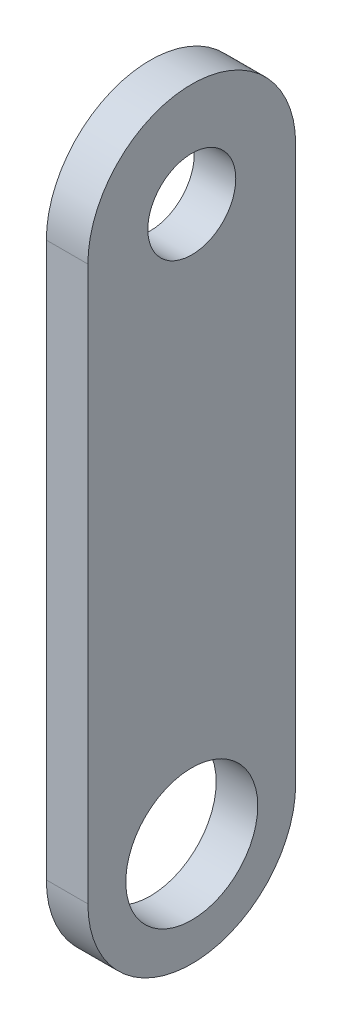
ISO-10303-21;
HEADER;
FILE_DESCRIPTION(('STEP AP214'),'2;1');
FILE_NAME('part.step','',(''),(''),'','','');
FILE_SCHEMA(('AUTOMOTIVE_DESIGN { 1 0 10303 214 1 1 1 1 }'));
ENDSEC;
DATA;
#1=APPLICATION_CONTEXT('core data for automotive mechanical design processes');
#2=APPLICATION_PROTOCOL_DEFINITION('international standard','automotive_design',2000,#1);
#3=PRODUCT_CONTEXT('',#1,'mechanical');
#4=PRODUCT('Part','Part','',(#3));
#5=PRODUCT_RELATED_PRODUCT_CATEGORY('part','',(#4));
#6=PRODUCT_DEFINITION_FORMATION('','',#4);
#7=PRODUCT_DEFINITION_CONTEXT('part definition',#1,'design');
#8=PRODUCT_DEFINITION('design','',#6,#7);
#9=PRODUCT_DEFINITION_SHAPE('','',#8);
#10=(LENGTH_UNIT() NAMED_UNIT(*) SI_UNIT(.MILLI.,.METRE.));
#11=(NAMED_UNIT(*) PLANE_ANGLE_UNIT() SI_UNIT($,.RADIAN.));
#12=(NAMED_UNIT(*) SI_UNIT($,.STERADIAN.) SOLID_ANGLE_UNIT());
#13=UNCERTAINTY_MEASURE_WITH_UNIT(LENGTH_MEASURE(1.E-05),#10,'distance_accuracy_value','');
#14=(GEOMETRIC_REPRESENTATION_CONTEXT(3) GLOBAL_UNCERTAINTY_ASSIGNED_CONTEXT((#13)) GLOBAL_UNIT_ASSIGNED_CONTEXT((#10,
#11,#12)) REPRESENTATION_CONTEXT('',''));
#15=CARTESIAN_POINT('',(0.,0.,0.));
#16=DIRECTION('',(0.,0.,1.));
#17=DIRECTION('',(1.,0.,0.));
#18=AXIS2_PLACEMENT_3D('',#15,#16,#17);
#19=CARTESIAN_POINT('',(3.,-20.,0.));
#20=DIRECTION('',(-1.,0.,0.));
#21=DIRECTION('',(0.,0.,1.));
#22=AXIS2_PLACEMENT_3D('',#19,#20,#21);
#23=CYLINDRICAL_SURFACE('',#22,7.5);
#24=DIRECTION('',(-1.,0.,0.));
#25=VECTOR('',#24,1.);
#26=CARTESIAN_POINT('',(3.,-20.,-7.5));
#27=LINE('',#26,#25);
#28=CARTESIAN_POINT('',(3.,-20.,-7.5));
#29=VERTEX_POINT('',#28);
#30=CARTESIAN_POINT('',(0.,-20.,-7.5));
#31=VERTEX_POINT('',#30);
#32=EDGE_CURVE('E98',#29,#31,#27,.T.);
#33=ORIENTED_EDGE('',*,*,#32,.F.);
#34=CARTESIAN_POINT('',(3.,-20.,0.));
#35=DIRECTION('',(-1.,0.,0.));
#36=DIRECTION('',(0.,0.,1.));
#37=AXIS2_PLACEMENT_3D('',#34,#35,#36);
#38=CIRCLE('',#37,7.5);
#39=CARTESIAN_POINT('',(3.,-20.,7.5));
#40=VERTEX_POINT('',#39);
#41=EDGE_CURVE('E50',#40,#29,#38,.F.);
#42=ORIENTED_EDGE('',*,*,#41,.F.);
#43=DIRECTION('',(1.,0.,0.));
#44=VECTOR('',#43,1.);
#45=CARTESIAN_POINT('',(3.,-20.,7.5));
#46=LINE('',#45,#44);
#47=CARTESIAN_POINT('',(0.,-20.,7.5));
#48=VERTEX_POINT('',#47);
#49=EDGE_CURVE('E120',#48,#40,#46,.T.);
#50=ORIENTED_EDGE('',*,*,#49,.F.);
#51=CARTESIAN_POINT('',(0.,-20.,0.));
#52=DIRECTION('',(-1.,0.,0.));
#53=DIRECTION('',(0.,0.,1.));
#54=AXIS2_PLACEMENT_3D('',#51,#52,#53);
#55=CIRCLE('',#54,7.5);
#56=EDGE_CURVE('E11',#31,#48,#55,.T.);
#57=ORIENTED_EDGE('',*,*,#56,.F.);
#58=EDGE_LOOP('',(#33,#42,#50,#57));
#59=FACE_BOUND('',#58,.T.);
#60=ADVANCED_FACE('F41',(#59),#23,.T.);
#61=CARTESIAN_POINT('',(3.,20.,0.));
#62=DIRECTION('',(-1.,0.,0.));
#63=DIRECTION('',(0.,0.,1.));
#64=AXIS2_PLACEMENT_3D('',#61,#62,#63);
#65=CYLINDRICAL_SURFACE('',#64,7.5);
#66=DIRECTION('',(-1.,0.,0.));
#67=VECTOR('',#66,1.);
#68=CARTESIAN_POINT('',(3.,20.,7.5));
#69=LINE('',#68,#67);
#70=CARTESIAN_POINT('',(3.,20.,7.5));
#71=VERTEX_POINT('',#70);
#72=CARTESIAN_POINT('',(0.,20.,7.5));
#73=VERTEX_POINT('',#72);
#74=EDGE_CURVE('E94',#71,#73,#69,.T.);
#75=ORIENTED_EDGE('',*,*,#74,.F.);
#76=CARTESIAN_POINT('',(3.,20.,0.));
#77=DIRECTION('',(-1.,0.,0.));
#78=DIRECTION('',(0.,0.,1.));
#79=AXIS2_PLACEMENT_3D('',#76,#77,#78);
#80=CIRCLE('',#79,7.5);
#81=CARTESIAN_POINT('',(3.,20.,-7.5));
#82=VERTEX_POINT('',#81);
#83=EDGE_CURVE('E99',#82,#71,#80,.F.);
#84=ORIENTED_EDGE('',*,*,#83,.F.);
#85=DIRECTION('',(1.,0.,0.));
#86=VECTOR('',#85,1.);
#87=CARTESIAN_POINT('',(3.,20.,-7.5));
#88=LINE('',#87,#86);
#89=CARTESIAN_POINT('',(0.,20.,-7.5));
#90=VERTEX_POINT('',#89);
#91=EDGE_CURVE('E96',#90,#82,#88,.T.);
#92=ORIENTED_EDGE('',*,*,#91,.F.);
#93=CARTESIAN_POINT('',(0.,20.,0.));
#94=DIRECTION('',(-1.,0.,0.));
#95=DIRECTION('',(0.,0.,1.));
#96=AXIS2_PLACEMENT_3D('',#93,#94,#95);
#97=CIRCLE('',#96,7.5);
#98=EDGE_CURVE('E82',#73,#90,#97,.T.);
#99=ORIENTED_EDGE('',*,*,#98,.F.);
#100=EDGE_LOOP('',(#75,#84,#92,#99));
#101=FACE_BOUND('',#100,.T.);
#102=ADVANCED_FACE('F92',(#101),#65,.T.);
#103=CARTESIAN_POINT('',(3.,-27.5,7.5));
#104=DIRECTION('',(0.,0.,1.));
#105=DIRECTION('',(1.,0.,0.));
#106=AXIS2_PLACEMENT_3D('',#103,#104,#105);
#107=PLANE('',#106);
#108=DIRECTION('',(0.,1.,0.));
#109=VECTOR('',#108,1.);
#110=CARTESIAN_POINT('',(0.,-27.5,7.5));
#111=LINE('',#110,#109);
#112=EDGE_CURVE('E79',#48,#73,#111,.T.);
#113=ORIENTED_EDGE('',*,*,#112,.F.);
#114=ORIENTED_EDGE('',*,*,#49,.T.);
#115=DIRECTION('',(0.,1.,0.));
#116=VECTOR('',#115,1.);
#117=CARTESIAN_POINT('',(3.,-27.5,7.5));
#118=LINE('',#117,#116);
#119=EDGE_CURVE('E103',#40,#71,#118,.T.);
#120=ORIENTED_EDGE('',*,*,#119,.T.);
#121=ORIENTED_EDGE('',*,*,#74,.T.);
#122=EDGE_LOOP('',(#113,#114,#120,#121));
#123=FACE_BOUND('',#122,.T.);
#124=ADVANCED_FACE('F101',(#123),#107,.T.);
#125=CARTESIAN_POINT('',(3.,-27.5,-7.5));
#126=DIRECTION('',(0.,0.,1.));
#127=DIRECTION('',(1.,0.,0.));
#128=AXIS2_PLACEMENT_3D('',#125,#126,#127);
#129=PLANE('',#128);
#130=DIRECTION('',(0.,1.,0.));
#131=VECTOR('',#130,1.);
#132=CARTESIAN_POINT('',(3.,-27.5,-7.5));
#133=LINE('',#132,#131);
#134=EDGE_CURVE('E106',#29,#82,#133,.T.);
#135=ORIENTED_EDGE('',*,*,#134,.F.);
#136=ORIENTED_EDGE('',*,*,#32,.T.);
#137=DIRECTION('',(0.,1.,0.));
#138=VECTOR('',#137,1.);
#139=CARTESIAN_POINT('',(0.,-27.5,-7.5));
#140=LINE('',#139,#138);
#141=EDGE_CURVE('E87',#31,#90,#140,.T.);
#142=ORIENTED_EDGE('',*,*,#141,.T.);
#143=ORIENTED_EDGE('',*,*,#91,.T.);
#144=EDGE_LOOP('',(#135,#136,#142,#143));
#145=FACE_BOUND('',#144,.T.);
#146=ADVANCED_FACE('F127',(#145),#129,.F.);
#147=CARTESIAN_POINT('',(3.,0.,0.));
#148=DIRECTION('',(-1.,0.,0.));
#149=DIRECTION('',(0.,0.,1.));
#150=AXIS2_PLACEMENT_3D('',#147,#148,#149);
#151=PLANE('',#150);
#152=CARTESIAN_POINT('',(3.,20.,0.));
#153=DIRECTION('',(1.,0.,0.));
#154=DIRECTION('',(0.,0.,-1.));
#155=AXIS2_PLACEMENT_3D('',#152,#153,#154);
#156=CIRCLE('',#155,3.175);
#157=CARTESIAN_POINT('',(3.,20.,-3.175));
#158=VERTEX_POINT('',#157);
#159=EDGE_CURVE('E135',#158,#158,#156,.T.);
#160=ORIENTED_EDGE('',*,*,#159,.F.);
#161=EDGE_LOOP('',(#160));
#162=FACE_BOUND('',#161,.T.);
#163=CARTESIAN_POINT('',(3.,-20.,0.));
#164=DIRECTION('',(1.,0.,0.));
#165=DIRECTION('',(0.,0.,-1.));
#166=AXIS2_PLACEMENT_3D('',#163,#164,#165);
#167=CIRCLE('',#166,4.7625);
#168=CARTESIAN_POINT('',(3.,-20.,-4.7625));
#169=VERTEX_POINT('',#168);
#170=EDGE_CURVE('E142',#169,#169,#167,.T.);
#171=ORIENTED_EDGE('',*,*,#170,.F.);
#172=EDGE_LOOP('',(#171));
#173=FACE_BOUND('',#172,.T.);
#174=ORIENTED_EDGE('',*,*,#119,.F.);
#175=ORIENTED_EDGE('',*,*,#41,.T.);
#176=ORIENTED_EDGE('',*,*,#134,.T.);
#177=ORIENTED_EDGE('',*,*,#83,.T.);
#178=EDGE_LOOP('',(#174,#175,#176,#177));
#179=FACE_BOUND('',#178,.T.);
#180=ADVANCED_FACE('F124',(#162,#173,#179),#151,.F.);
#181=CARTESIAN_POINT('',(0.,0.,0.));
#182=DIRECTION('',(-1.,0.,0.));
#183=DIRECTION('',(0.,0.,1.));
#184=AXIS2_PLACEMENT_3D('',#181,#182,#183);
#185=PLANE('',#184);
#186=CARTESIAN_POINT('',(0.,20.,0.));
#187=DIRECTION('',(-1.,0.,0.));
#188=DIRECTION('',(0.,0.,1.));
#189=AXIS2_PLACEMENT_3D('',#186,#187,#188);
#190=CIRCLE('',#189,3.175);
#191=CARTESIAN_POINT('',(0.,20.,3.175));
#192=VERTEX_POINT('',#191);
#193=EDGE_CURVE('E88',#192,#192,#190,.T.);
#194=ORIENTED_EDGE('',*,*,#193,.F.);
#195=EDGE_LOOP('',(#194));
#196=FACE_BOUND('',#195,.T.);
#197=CARTESIAN_POINT('',(0.,-20.,0.));
#198=DIRECTION('',(-1.,0.,0.));
#199=DIRECTION('',(0.,0.,1.));
#200=AXIS2_PLACEMENT_3D('',#197,#198,#199);
#201=CIRCLE('',#200,4.7625);
#202=CARTESIAN_POINT('',(0.,-20.,4.7625));
#203=VERTEX_POINT('',#202);
#204=EDGE_CURVE('E132',#203,#203,#201,.T.);
#205=ORIENTED_EDGE('',*,*,#204,.F.);
#206=EDGE_LOOP('',(#205));
#207=FACE_BOUND('',#206,.T.);
#208=ORIENTED_EDGE('',*,*,#141,.F.);
#209=ORIENTED_EDGE('',*,*,#56,.T.);
#210=ORIENTED_EDGE('',*,*,#112,.T.);
#211=ORIENTED_EDGE('',*,*,#98,.T.);
#212=EDGE_LOOP('',(#208,#209,#210,#211));
#213=FACE_BOUND('',#212,.T.);
#214=ADVANCED_FACE('F81',(#196,#207,#213),#185,.T.);
#215=CARTESIAN_POINT('',(-2.,-20.,0.));
#216=DIRECTION('',(1.,0.,0.));
#217=DIRECTION('',(0.,0.,-1.));
#218=AXIS2_PLACEMENT_3D('',#215,#216,#217);
#219=CYLINDRICAL_SURFACE('',#218,4.7625);
#220=ORIENTED_EDGE('',*,*,#204,.T.);
#221=EDGE_LOOP('',(#220));
#222=FACE_BOUND('',#221,.T.);
#223=ORIENTED_EDGE('',*,*,#170,.T.);
#224=EDGE_LOOP('',(#223));
#225=FACE_BOUND('',#224,.T.);
#226=ADVANCED_FACE('F151',(#222,#225),#219,.F.);
#227=CARTESIAN_POINT('',(-2.,20.,0.));
#228=DIRECTION('',(1.,0.,0.));
#229=DIRECTION('',(0.,0.,-1.));
#230=AXIS2_PLACEMENT_3D('',#227,#228,#229);
#231=CYLINDRICAL_SURFACE('',#230,3.175);
#232=ORIENTED_EDGE('',*,*,#193,.T.);
#233=EDGE_LOOP('',(#232));
#234=FACE_BOUND('',#233,.T.);
#235=ORIENTED_EDGE('',*,*,#159,.T.);
#236=EDGE_LOOP('',(#235));
#237=FACE_BOUND('',#236,.T.);
#238=ADVANCED_FACE('F202',(#234,#237),#231,.F.);
#239=CLOSED_SHELL('',(#60,#102,#124,#146,#180,#214,#226,#238));
#240=MANIFOLD_SOLID_BREP('B2',#239);
#241=ADVANCED_BREP_SHAPE_REPRESENTATION('',(#18,#240),#14);
#242=SHAPE_DEFINITION_REPRESENTATION(#9,#241);
ENDSEC;
END-ISO-10303-21;
